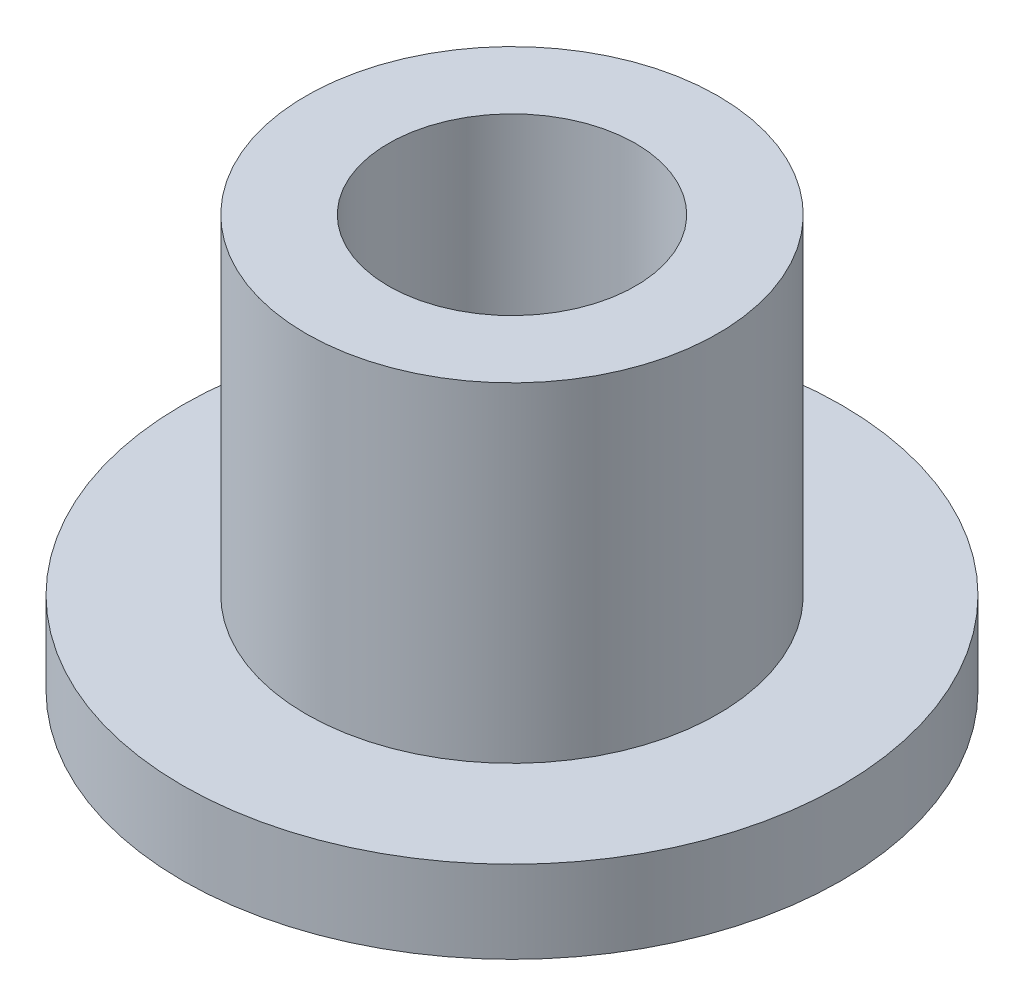
ISO-10303-21;
HEADER;
FILE_DESCRIPTION(('STEP AP214'),'2;1');
FILE_NAME('part.step','',(''),(''),'','','');
FILE_SCHEMA(('AUTOMOTIVE_DESIGN { 1 0 10303 214 1 1 1 1 }'));
ENDSEC;
DATA;
#1=APPLICATION_CONTEXT('core data for automotive mechanical design processes');
#2=APPLICATION_PROTOCOL_DEFINITION('international standard','automotive_design',2000,#1);
#3=PRODUCT_CONTEXT('',#1,'mechanical');
#4=PRODUCT('Part','Part','',(#3));
#5=PRODUCT_RELATED_PRODUCT_CATEGORY('part','',(#4));
#6=PRODUCT_DEFINITION_FORMATION('','',#4);
#7=PRODUCT_DEFINITION_CONTEXT('part definition',#1,'design');
#8=PRODUCT_DEFINITION('design','',#6,#7);
#9=PRODUCT_DEFINITION_SHAPE('','',#8);
#10=(LENGTH_UNIT() NAMED_UNIT(*) SI_UNIT(.MILLI.,.METRE.));
#11=(NAMED_UNIT(*) PLANE_ANGLE_UNIT() SI_UNIT($,.RADIAN.));
#12=(NAMED_UNIT(*) SI_UNIT($,.STERADIAN.) SOLID_ANGLE_UNIT());
#13=UNCERTAINTY_MEASURE_WITH_UNIT(LENGTH_MEASURE(1.E-05),#10,'distance_accuracy_value','');
#14=(GEOMETRIC_REPRESENTATION_CONTEXT(3) GLOBAL_UNCERTAINTY_ASSIGNED_CONTEXT((#13)) GLOBAL_UNIT_ASSIGNED_CONTEXT((#10,
#11,#12)) REPRESENTATION_CONTEXT('',''));
#15=CARTESIAN_POINT('',(0.,0.,0.));
#16=DIRECTION('',(0.,0.,1.));
#17=DIRECTION('',(1.,0.,0.));
#18=AXIS2_PLACEMENT_3D('',#15,#16,#17);
#19=CARTESIAN_POINT('',(0.,2.,0.));
#20=DIRECTION('',(0.,1.,0.));
#21=DIRECTION('',(0.,0.,1.));
#22=AXIS2_PLACEMENT_3D('',#19,#20,#21);
#23=PLANE('',#22);
#24=CARTESIAN_POINT('',(0.,2.,0.));
#25=DIRECTION('',(0.,1.,0.));
#26=DIRECTION('',(0.,0.,1.));
#27=AXIS2_PLACEMENT_3D('',#24,#25,#26);
#28=CIRCLE('',#27,4.);
#29=CARTESIAN_POINT('',(0.,2.,4.));
#30=VERTEX_POINT('',#29);
#31=EDGE_CURVE('E53',#30,#30,#28,.T.);
#32=ORIENTED_EDGE('',*,*,#31,.T.);
#33=EDGE_LOOP('',(#32));
#34=FACE_BOUND('',#33,.T.);
#35=CARTESIAN_POINT('',(0.,2.,0.));
#36=DIRECTION('',(0.,1.,0.));
#37=DIRECTION('',(0.,0.,1.));
#38=AXIS2_PLACEMENT_3D('',#35,#36,#37);
#39=CIRCLE('',#38,2.5);
#40=CARTESIAN_POINT('',(0.,2.,2.5));
#41=VERTEX_POINT('',#40);
#42=EDGE_CURVE('E65',#41,#41,#39,.T.);
#43=ORIENTED_EDGE('',*,*,#42,.F.);
#44=EDGE_LOOP('',(#43));
#45=FACE_BOUND('',#44,.T.);
#46=ADVANCED_FACE('F39',(#34,#45),#23,.T.);
#47=CARTESIAN_POINT('',(0.,0.,0.));
#48=DIRECTION('',(0.,1.,0.));
#49=DIRECTION('',(0.,0.,1.));
#50=AXIS2_PLACEMENT_3D('',#47,#48,#49);
#51=PLANE('',#50);
#52=CARTESIAN_POINT('',(0.,0.,0.));
#53=DIRECTION('',(0.,1.,0.));
#54=DIRECTION('',(0.,0.,1.));
#55=AXIS2_PLACEMENT_3D('',#52,#53,#54);
#56=CIRCLE('',#55,2.26794919243112);
#57=CARTESIAN_POINT('',(0.,0.,2.26794919243112));
#58=VERTEX_POINT('',#57);
#59=EDGE_CURVE('E10',#58,#58,#56,.F.);
#60=ORIENTED_EDGE('',*,*,#59,.T.);
#61=EDGE_LOOP('',(#60));
#62=FACE_BOUND('',#61,.T.);
#63=CARTESIAN_POINT('',(0.,0.,0.));
#64=DIRECTION('',(0.,1.,0.));
#65=DIRECTION('',(0.,0.,1.));
#66=AXIS2_PLACEMENT_3D('',#63,#64,#65);
#67=CIRCLE('',#66,1.5);
#68=CARTESIAN_POINT('',(0.,0.,1.5));
#69=VERTEX_POINT('',#68);
#70=EDGE_CURVE('E58',#69,#69,#67,.T.);
#71=ORIENTED_EDGE('',*,*,#70,.T.);
#72=EDGE_LOOP('',(#71));
#73=FACE_BOUND('',#72,.T.);
#74=ADVANCED_FACE('F94',(#62,#73),#51,.F.);
#75=CARTESIAN_POINT('',(0.,2.,0.));
#76=DIRECTION('',(0.,-1.,0.));
#77=DIRECTION('',(0.,0.,-1.));
#78=AXIS2_PLACEMENT_3D('',#75,#76,#77);
#79=CYLINDRICAL_SURFACE('',#78,4.);
#80=CARTESIAN_POINT('',(0.,1.,0.));
#81=DIRECTION('',(0.,1.,0.));
#82=DIRECTION('',(0.,0.,1.));
#83=AXIS2_PLACEMENT_3D('',#80,#81,#82);
#84=CIRCLE('',#83,4.);
#85=CARTESIAN_POINT('',(0.,1.,4.));
#86=VERTEX_POINT('',#85);
#87=EDGE_CURVE('E48',#86,#86,#84,.T.);
#88=ORIENTED_EDGE('',*,*,#87,.T.);
#89=EDGE_LOOP('',(#88));
#90=FACE_BOUND('',#89,.T.);
#91=ORIENTED_EDGE('',*,*,#31,.F.);
#92=EDGE_LOOP('',(#91));
#93=FACE_BOUND('',#92,.T.);
#94=ADVANCED_FACE('F90',(#90,#93),#79,.T.);
#95=CARTESIAN_POINT('',(0.,2.,0.));
#96=DIRECTION('',(0.,-1.,0.));
#97=DIRECTION('',(0.,0.,-1.));
#98=AXIS2_PLACEMENT_3D('',#95,#96,#97);
#99=CYLINDRICAL_SURFACE('',#98,1.5);
#100=ORIENTED_EDGE('',*,*,#70,.F.);
#101=EDGE_LOOP('',(#100));
#102=FACE_BOUND('',#101,.T.);
#103=CARTESIAN_POINT('',(0.,6.,0.));
#104=DIRECTION('',(0.,1.,0.));
#105=DIRECTION('',(0.,0.,1.));
#106=AXIS2_PLACEMENT_3D('',#103,#104,#105);
#107=CIRCLE('',#106,1.5);
#108=CARTESIAN_POINT('',(0.,6.,1.5));
#109=VERTEX_POINT('',#108);
#110=EDGE_CURVE('E69',#109,#109,#107,.T.);
#111=ORIENTED_EDGE('',*,*,#110,.T.);
#112=EDGE_LOOP('',(#111));
#113=FACE_BOUND('',#112,.T.);
#114=ADVANCED_FACE('F77',(#102,#113),#99,.F.);
#115=CARTESIAN_POINT('',(0.,6.,0.));
#116=DIRECTION('',(0.,1.,0.));
#117=DIRECTION('',(0.,0.,1.));
#118=AXIS2_PLACEMENT_3D('',#115,#116,#117);
#119=PLANE('',#118);
#120=CARTESIAN_POINT('',(0.,6.,0.));
#121=DIRECTION('',(0.,1.,0.));
#122=DIRECTION('',(0.,0.,1.));
#123=AXIS2_PLACEMENT_3D('',#120,#121,#122);
#124=CIRCLE('',#123,2.5);
#125=CARTESIAN_POINT('',(0.,6.,2.5));
#126=VERTEX_POINT('',#125);
#127=EDGE_CURVE('E64',#126,#126,#124,.T.);
#128=ORIENTED_EDGE('',*,*,#127,.T.);
#129=EDGE_LOOP('',(#128));
#130=FACE_BOUND('',#129,.T.);
#131=ORIENTED_EDGE('',*,*,#110,.F.);
#132=EDGE_LOOP('',(#131));
#133=FACE_BOUND('',#132,.T.);
#134=ADVANCED_FACE('F79',(#130,#133),#119,.T.);
#135=CARTESIAN_POINT('',(0.,6.,0.));
#136=DIRECTION('',(0.,-1.,0.));
#137=DIRECTION('',(0.,0.,-1.));
#138=AXIS2_PLACEMENT_3D('',#135,#136,#137);
#139=CYLINDRICAL_SURFACE('',#138,2.5);
#140=ORIENTED_EDGE('',*,*,#127,.F.);
#141=EDGE_LOOP('',(#140));
#142=FACE_BOUND('',#141,.T.);
#143=ORIENTED_EDGE('',*,*,#42,.T.);
#144=EDGE_LOOP('',(#143));
#145=FACE_BOUND('',#144,.T.);
#146=ADVANCED_FACE('F81',(#142,#145),#139,.T.);
#147=CARTESIAN_POINT('',(0.,1.,0.));
#148=DIRECTION('',(0.,1.,0.));
#149=DIRECTION('',(0.,0.,1.));
#150=AXIS2_PLACEMENT_3D('',#147,#148,#149);
#151=CONICAL_SURFACE('',#150,4.,1.0471975511966);
#152=ORIENTED_EDGE('',*,*,#59,.F.);
#153=EDGE_LOOP('',(#152));
#154=FACE_BOUND('',#153,.T.);
#155=ORIENTED_EDGE('',*,*,#87,.F.);
#156=EDGE_LOOP('',(#155));
#157=FACE_BOUND('',#156,.T.);
#158=ADVANCED_FACE('F42',(#154,#157),#151,.T.);
#159=CLOSED_SHELL('',(#46,#74,#94,#114,#134,#146,#158));
#160=MANIFOLD_SOLID_BREP('B2',#159);
#161=ADVANCED_BREP_SHAPE_REPRESENTATION('',(#18,#160),#14);
#162=SHAPE_DEFINITION_REPRESENTATION(#9,#161);
ENDSEC;
END-ISO-10303-21;
